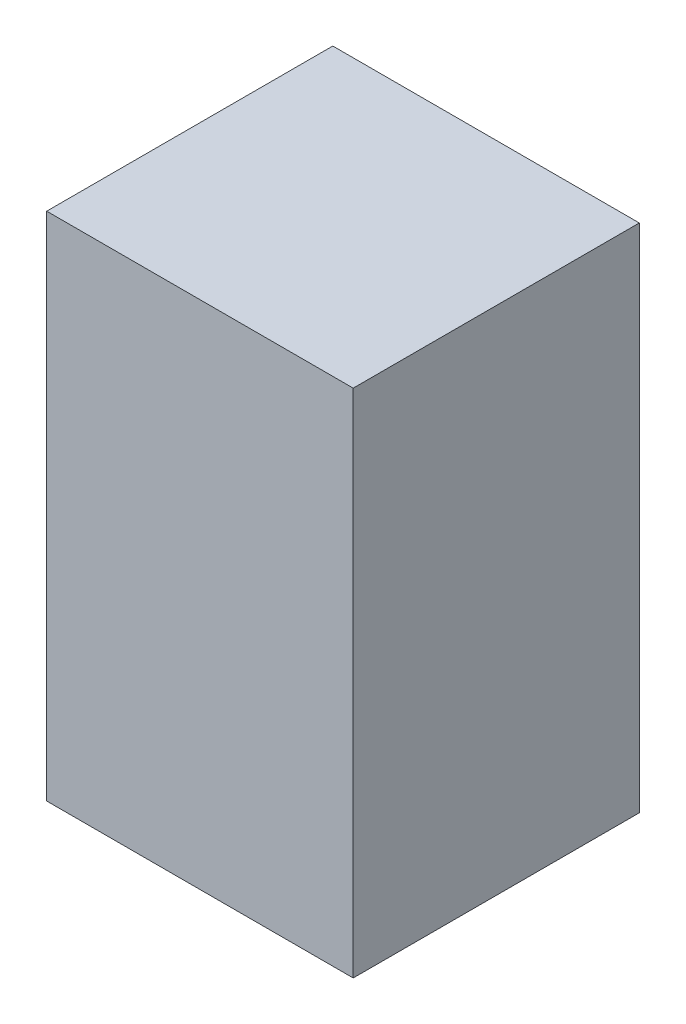
ISO-10303-21;
HEADER;
FILE_DESCRIPTION(('STEP AP214'),'2;1');
FILE_NAME('part.step','',(''),(''),'','','');
FILE_SCHEMA(('AUTOMOTIVE_DESIGN { 1 0 10303 214 1 1 1 1 }'));
ENDSEC;
DATA;
#1=APPLICATION_CONTEXT('core data for automotive mechanical design processes');
#2=APPLICATION_PROTOCOL_DEFINITION('international standard','automotive_design',2000,#1);
#3=PRODUCT_CONTEXT('',#1,'mechanical');
#4=PRODUCT('Part','Part','',(#3));
#5=PRODUCT_RELATED_PRODUCT_CATEGORY('part','',(#4));
#6=PRODUCT_DEFINITION_FORMATION('','',#4);
#7=PRODUCT_DEFINITION_CONTEXT('part definition',#1,'design');
#8=PRODUCT_DEFINITION('design','',#6,#7);
#9=PRODUCT_DEFINITION_SHAPE('','',#8);
#10=(LENGTH_UNIT() NAMED_UNIT(*) SI_UNIT(.MILLI.,.METRE.));
#11=(NAMED_UNIT(*) PLANE_ANGLE_UNIT() SI_UNIT($,.RADIAN.));
#12=(NAMED_UNIT(*) SI_UNIT($,.STERADIAN.) SOLID_ANGLE_UNIT());
#13=UNCERTAINTY_MEASURE_WITH_UNIT(LENGTH_MEASURE(1.E-05),#10,'distance_accuracy_value','');
#14=(GEOMETRIC_REPRESENTATION_CONTEXT(3) GLOBAL_UNCERTAINTY_ASSIGNED_CONTEXT((#13)) GLOBAL_UNIT_ASSIGNED_CONTEXT((#10,
#11,#12)) REPRESENTATION_CONTEXT('',''));
#15=CARTESIAN_POINT('',(0.,0.,0.));
#16=DIRECTION('',(0.,0.,1.));
#17=DIRECTION('',(1.,0.,0.));
#18=AXIS2_PLACEMENT_3D('',#15,#16,#17);
#19=CARTESIAN_POINT('',(22.5,-75.,21.));
#20=DIRECTION('',(1.,0.,0.));
#21=DIRECTION('',(0.,0.,-1.));
#22=AXIS2_PLACEMENT_3D('',#19,#20,#21);
#23=PLANE('',#22);
#24=DIRECTION('',(0.,0.,-1.));
#25=VECTOR('',#24,1.);
#26=CARTESIAN_POINT('',(22.5,0.,21.));
#27=LINE('',#26,#25);
#28=CARTESIAN_POINT('',(22.5,0.,21.));
#29=VERTEX_POINT('',#28);
#30=CARTESIAN_POINT('',(22.5,0.,-21.));
#31=VERTEX_POINT('',#30);
#32=EDGE_CURVE('E98',#29,#31,#27,.T.);
#33=ORIENTED_EDGE('',*,*,#32,.F.);
#34=DIRECTION('',(0.,1.,0.));
#35=VECTOR('',#34,1.);
#36=CARTESIAN_POINT('',(22.5,-75.,21.));
#37=LINE('',#36,#35);
#38=CARTESIAN_POINT('',(22.5,-75.,21.));
#39=VERTEX_POINT('',#38);
#40=EDGE_CURVE('E11',#39,#29,#37,.T.);
#41=ORIENTED_EDGE('',*,*,#40,.F.);
#42=DIRECTION('',(0.,0.,-1.));
#43=VECTOR('',#42,1.);
#44=CARTESIAN_POINT('',(22.5,-75.,21.));
#45=LINE('',#44,#43);
#46=CARTESIAN_POINT('',(22.5,-75.,-21.));
#47=VERTEX_POINT('',#46);
#48=EDGE_CURVE('E92',#39,#47,#45,.T.);
#49=ORIENTED_EDGE('',*,*,#48,.T.);
#50=DIRECTION('',(0.,1.,0.));
#51=VECTOR('',#50,1.);
#52=CARTESIAN_POINT('',(22.5,-75.,-21.));
#53=LINE('',#52,#51);
#54=EDGE_CURVE('E37',#47,#31,#53,.T.);
#55=ORIENTED_EDGE('',*,*,#54,.T.);
#56=EDGE_LOOP('',(#33,#41,#49,#55));
#57=FACE_BOUND('',#56,.T.);
#58=ADVANCED_FACE('F34',(#57),#23,.T.);
#59=CARTESIAN_POINT('',(-22.5,-75.,21.));
#60=DIRECTION('',(0.,0.,1.));
#61=DIRECTION('',(1.,0.,0.));
#62=AXIS2_PLACEMENT_3D('',#59,#60,#61);
#63=PLANE('',#62);
#64=DIRECTION('',(1.,0.,0.));
#65=VECTOR('',#64,1.);
#66=CARTESIAN_POINT('',(-22.5,0.,21.));
#67=LINE('',#66,#65);
#68=CARTESIAN_POINT('',(-22.5,0.,21.));
#69=VERTEX_POINT('',#68);
#70=EDGE_CURVE('E94',#69,#29,#67,.T.);
#71=ORIENTED_EDGE('',*,*,#70,.F.);
#72=DIRECTION('',(0.,1.,0.));
#73=VECTOR('',#72,1.);
#74=CARTESIAN_POINT('',(-22.5,-75.,21.));
#75=LINE('',#74,#73);
#76=CARTESIAN_POINT('',(-22.5,-75.,21.));
#77=VERTEX_POINT('',#76);
#78=EDGE_CURVE('E43',#77,#69,#75,.T.);
#79=ORIENTED_EDGE('',*,*,#78,.F.);
#80=DIRECTION('',(1.,0.,0.));
#81=VECTOR('',#80,1.);
#82=CARTESIAN_POINT('',(-22.5,-75.,21.));
#83=LINE('',#82,#81);
#84=EDGE_CURVE('E89',#77,#39,#83,.T.);
#85=ORIENTED_EDGE('',*,*,#84,.T.);
#86=ORIENTED_EDGE('',*,*,#40,.T.);
#87=EDGE_LOOP('',(#71,#79,#85,#86));
#88=FACE_BOUND('',#87,.T.);
#89=ADVANCED_FACE('F108',(#88),#63,.T.);
#90=CARTESIAN_POINT('',(-22.5,-75.,21.));
#91=DIRECTION('',(-1.,0.,0.));
#92=DIRECTION('',(0.,0.,1.));
#93=AXIS2_PLACEMENT_3D('',#90,#91,#92);
#94=PLANE('',#93);
#95=DIRECTION('',(0.,0.,1.));
#96=VECTOR('',#95,1.);
#97=CARTESIAN_POINT('',(-22.5,0.,21.));
#98=LINE('',#97,#96);
#99=CARTESIAN_POINT('',(-22.5,0.,-21.));
#100=VERTEX_POINT('',#99);
#101=EDGE_CURVE('E84',#100,#69,#98,.T.);
#102=ORIENTED_EDGE('',*,*,#101,.F.);
#103=DIRECTION('',(0.,1.,0.));
#104=VECTOR('',#103,1.);
#105=CARTESIAN_POINT('',(-22.5,-75.,-21.));
#106=LINE('',#105,#104);
#107=CARTESIAN_POINT('',(-22.5,-75.,-21.));
#108=VERTEX_POINT('',#107);
#109=EDGE_CURVE('E79',#108,#100,#106,.T.);
#110=ORIENTED_EDGE('',*,*,#109,.F.);
#111=DIRECTION('',(0.,0.,1.));
#112=VECTOR('',#111,1.);
#113=CARTESIAN_POINT('',(-22.5,-75.,21.));
#114=LINE('',#113,#112);
#115=EDGE_CURVE('E82',#108,#77,#114,.T.);
#116=ORIENTED_EDGE('',*,*,#115,.T.);
#117=ORIENTED_EDGE('',*,*,#78,.T.);
#118=EDGE_LOOP('',(#102,#110,#116,#117));
#119=FACE_BOUND('',#118,.T.);
#120=ADVANCED_FACE('F81',(#119),#94,.T.);
#121=CARTESIAN_POINT('',(-22.5,-75.,-21.));
#122=DIRECTION('',(0.,0.,-1.));
#123=DIRECTION('',(-1.,0.,0.));
#124=AXIS2_PLACEMENT_3D('',#121,#122,#123);
#125=PLANE('',#124);
#126=DIRECTION('',(-1.,0.,0.));
#127=VECTOR('',#126,1.);
#128=CARTESIAN_POINT('',(-22.5,0.,-21.));
#129=LINE('',#128,#127);
#130=EDGE_CURVE('E101',#31,#100,#129,.T.);
#131=ORIENTED_EDGE('',*,*,#130,.F.);
#132=ORIENTED_EDGE('',*,*,#54,.F.);
#133=DIRECTION('',(-1.,0.,0.));
#134=VECTOR('',#133,1.);
#135=CARTESIAN_POINT('',(-22.5,-75.,-21.));
#136=LINE('',#135,#134);
#137=EDGE_CURVE('E88',#47,#108,#136,.T.);
#138=ORIENTED_EDGE('',*,*,#137,.T.);
#139=ORIENTED_EDGE('',*,*,#109,.T.);
#140=EDGE_LOOP('',(#131,#132,#138,#139));
#141=FACE_BOUND('',#140,.T.);
#142=ADVANCED_FACE('F91',(#141),#125,.T.);
#143=CARTESIAN_POINT('',(0.,-75.,0.));
#144=DIRECTION('',(0.,-1.,0.));
#145=DIRECTION('',(0.,0.,-1.));
#146=AXIS2_PLACEMENT_3D('',#143,#144,#145);
#147=PLANE('',#146);
#148=ORIENTED_EDGE('',*,*,#48,.F.);
#149=ORIENTED_EDGE('',*,*,#84,.F.);
#150=ORIENTED_EDGE('',*,*,#115,.F.);
#151=ORIENTED_EDGE('',*,*,#137,.F.);
#152=EDGE_LOOP('',(#148,#149,#150,#151));
#153=FACE_BOUND('',#152,.T.);
#154=ADVANCED_FACE('F87',(#153),#147,.T.);
#155=CARTESIAN_POINT('',(0.,0.,0.));
#156=DIRECTION('',(0.,-1.,0.));
#157=DIRECTION('',(0.,0.,-1.));
#158=AXIS2_PLACEMENT_3D('',#155,#156,#157);
#159=PLANE('',#158);
#160=ORIENTED_EDGE('',*,*,#32,.T.);
#161=ORIENTED_EDGE('',*,*,#130,.T.);
#162=ORIENTED_EDGE('',*,*,#101,.T.);
#163=ORIENTED_EDGE('',*,*,#70,.T.);
#164=EDGE_LOOP('',(#160,#161,#162,#163));
#165=FACE_BOUND('',#164,.T.);
#166=ADVANCED_FACE('F107',(#165),#159,.F.);
#167=CLOSED_SHELL('',(#58,#89,#120,#142,#154,#166));
#168=MANIFOLD_SOLID_BREP('B2',#167);
#169=ADVANCED_BREP_SHAPE_REPRESENTATION('',(#18,#168),#14);
#170=SHAPE_DEFINITION_REPRESENTATION(#9,#169);
ENDSEC;
END-ISO-10303-21;
